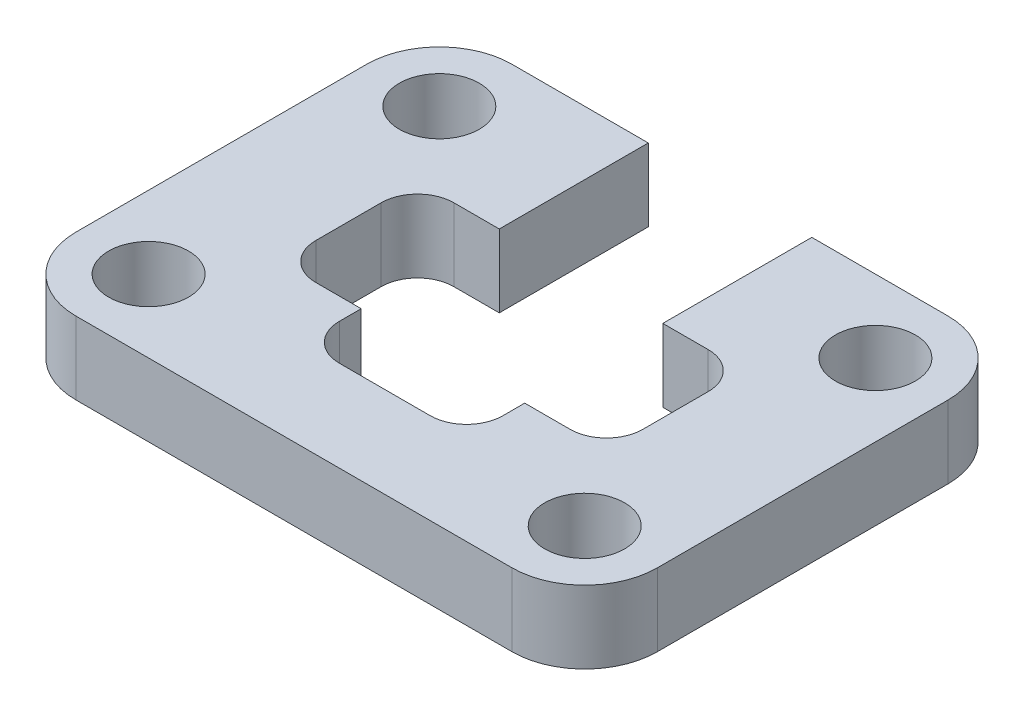
ISO-10303-21;
HEADER;
FILE_DESCRIPTION(('STEP AP214'),'2;1');
FILE_NAME('part.step','',(''),(''),'','','');
FILE_SCHEMA(('AUTOMOTIVE_DESIGN { 1 0 10303 214 1 1 1 1 }'));
ENDSEC;
DATA;
#1=APPLICATION_CONTEXT('core data for automotive mechanical design processes');
#2=APPLICATION_PROTOCOL_DEFINITION('international standard','automotive_design',2000,#1);
#3=PRODUCT_CONTEXT('',#1,'mechanical');
#4=PRODUCT('Part','Part','',(#3));
#5=PRODUCT_RELATED_PRODUCT_CATEGORY('part','',(#4));
#6=PRODUCT_DEFINITION_FORMATION('','',#4);
#7=PRODUCT_DEFINITION_CONTEXT('part definition',#1,'design');
#8=PRODUCT_DEFINITION('design','',#6,#7);
#9=PRODUCT_DEFINITION_SHAPE('','',#8);
#10=(LENGTH_UNIT() NAMED_UNIT(*) SI_UNIT(.MILLI.,.METRE.));
#11=(NAMED_UNIT(*) PLANE_ANGLE_UNIT() SI_UNIT($,.RADIAN.));
#12=(NAMED_UNIT(*) SI_UNIT($,.STERADIAN.) SOLID_ANGLE_UNIT());
#13=UNCERTAINTY_MEASURE_WITH_UNIT(LENGTH_MEASURE(1.E-05),#10,'distance_accuracy_value','');
#14=(GEOMETRIC_REPRESENTATION_CONTEXT(3) GLOBAL_UNCERTAINTY_ASSIGNED_CONTEXT((#13)) GLOBAL_UNIT_ASSIGNED_CONTEXT((#10,
#11,#12)) REPRESENTATION_CONTEXT('',''));
#15=CARTESIAN_POINT('',(0.,0.,0.));
#16=DIRECTION('',(0.,0.,1.));
#17=DIRECTION('',(1.,0.,0.));
#18=AXIS2_PLACEMENT_3D('',#15,#16,#17);
#19=CARTESIAN_POINT('',(2.25,2.,0.));
#20=DIRECTION('',(-1.,0.,0.));
#21=DIRECTION('',(0.,0.,1.));
#22=AXIS2_PLACEMENT_3D('',#19,#20,#21);
#23=PLANE('',#22);
#24=DIRECTION('',(0.,0.,-1.));
#25=VECTOR('',#24,1.);
#26=CARTESIAN_POINT('',(2.25,0.,0.));
#27=LINE('',#26,#25);
#28=CARTESIAN_POINT('',(2.25,0.,2.5));
#29=VERTEX_POINT('',#28);
#30=CARTESIAN_POINT('',(2.25,0.,1.9));
#31=VERTEX_POINT('',#30);
#32=EDGE_CURVE('E276',#29,#31,#27,.T.);
#33=ORIENTED_EDGE('',*,*,#32,.F.);
#34=DIRECTION('',(0.,-1.,0.));
#35=VECTOR('',#34,1.);
#36=CARTESIAN_POINT('',(2.25,2.,2.5));
#37=LINE('',#36,#35);
#38=CARTESIAN_POINT('',(2.25,2.,2.5));
#39=VERTEX_POINT('',#38);
#40=EDGE_CURVE('E353',#29,#39,#37,.F.);
#41=ORIENTED_EDGE('',*,*,#40,.T.);
#42=DIRECTION('',(0.,0.,-1.));
#43=VECTOR('',#42,1.);
#44=CARTESIAN_POINT('',(2.25,2.,0.));
#45=LINE('',#44,#43);
#46=CARTESIAN_POINT('',(2.25,2.,1.9));
#47=VERTEX_POINT('',#46);
#48=EDGE_CURVE('E236',#39,#47,#45,.T.);
#49=ORIENTED_EDGE('',*,*,#48,.T.);
#50=DIRECTION('',(0.,1.,0.));
#51=VECTOR('',#50,1.);
#52=CARTESIAN_POINT('',(2.25,2.,1.9));
#53=LINE('',#52,#51);
#54=EDGE_CURVE('E273',#31,#47,#53,.T.);
#55=ORIENTED_EDGE('',*,*,#54,.F.);
#56=EDGE_LOOP('',(#33,#41,#49,#55));
#57=FACE_BOUND('',#56,.T.);
#58=ADVANCED_FACE('F36',(#57),#23,.T.);
#59=CARTESIAN_POINT('',(-2.25,2.,0.));
#60=DIRECTION('',(-1.,0.,0.));
#61=DIRECTION('',(0.,0.,1.));
#62=AXIS2_PLACEMENT_3D('',#59,#60,#61);
#63=PLANE('',#62);
#64=DIRECTION('',(0.,0.,-1.));
#65=VECTOR('',#64,1.);
#66=CARTESIAN_POINT('',(-2.25,2.,0.));
#67=LINE('',#66,#65);
#68=CARTESIAN_POINT('',(-2.25,2.,2.5));
#69=VERTEX_POINT('',#68);
#70=CARTESIAN_POINT('',(-2.25,2.,1.9));
#71=VERTEX_POINT('',#70);
#72=EDGE_CURVE('E248',#69,#71,#67,.T.);
#73=ORIENTED_EDGE('',*,*,#72,.F.);
#74=DIRECTION('',(0.,-1.,0.));
#75=VECTOR('',#74,1.);
#76=CARTESIAN_POINT('',(-2.25,2.,2.5));
#77=LINE('',#76,#75);
#78=CARTESIAN_POINT('',(-2.25,0.,2.5));
#79=VERTEX_POINT('',#78);
#80=EDGE_CURVE('E355',#69,#79,#77,.T.);
#81=ORIENTED_EDGE('',*,*,#80,.T.);
#82=DIRECTION('',(0.,0.,-1.));
#83=VECTOR('',#82,1.);
#84=CARTESIAN_POINT('',(-2.25,0.,0.));
#85=LINE('',#84,#83);
#86=CARTESIAN_POINT('',(-2.25,0.,1.9));
#87=VERTEX_POINT('',#86);
#88=EDGE_CURVE('E282',#79,#87,#85,.T.);
#89=ORIENTED_EDGE('',*,*,#88,.T.);
#90=DIRECTION('',(0.,1.,0.));
#91=VECTOR('',#90,1.);
#92=CARTESIAN_POINT('',(-2.25,2.,1.9));
#93=LINE('',#92,#91);
#94=EDGE_CURVE('E227',#87,#71,#93,.T.);
#95=ORIENTED_EDGE('',*,*,#94,.T.);
#96=EDGE_LOOP('',(#73,#81,#89,#95));
#97=FACE_BOUND('',#96,.T.);
#98=ADVANCED_FACE('F460',(#97),#63,.F.);
#99=DIRECTION('',(0.,-1.,0.));
#100=VECTOR('',#99,1.);
#101=CARTESIAN_POINT('',(2.25,2.,-1.9));
#102=LINE('',#101,#100);
#103=CARTESIAN_POINT('',(2.25,2.,-1.9));
#104=VERTEX_POINT('',#103);
#105=CARTESIAN_POINT('',(2.25,0.,-1.9));
#106=VERTEX_POINT('',#105);
#107=EDGE_CURVE('E213',#104,#106,#102,.T.);
#108=ORIENTED_EDGE('',*,*,#107,.F.);
#109=CARTESIAN_POINT('',(2.25,2.,-6.));
#110=VERTEX_POINT('',#109);
#111=EDGE_CURVE('E224',#104,#110,#45,.T.);
#112=ORIENTED_EDGE('',*,*,#111,.T.);
#113=DIRECTION('',(0.,-1.,0.));
#114=VECTOR('',#113,1.);
#115=CARTESIAN_POINT('',(2.25,2.,-6.));
#116=LINE('',#115,#114);
#117=CARTESIAN_POINT('',(2.25,0.,-6.));
#118=VERTEX_POINT('',#117);
#119=EDGE_CURVE('E268',#110,#118,#116,.T.);
#120=ORIENTED_EDGE('',*,*,#119,.T.);
#121=EDGE_CURVE('E226',#106,#118,#27,.T.);
#122=ORIENTED_EDGE('',*,*,#121,.F.);
#123=EDGE_LOOP('',(#108,#112,#120,#122));
#124=FACE_BOUND('',#123,.T.);
#125=ADVANCED_FACE('F222',(#124),#23,.T.);
#126=CARTESIAN_POINT('',(0.,2.,3.5));
#127=DIRECTION('',(0.,0.,-1.));
#128=DIRECTION('',(-1.,0.,0.));
#129=AXIS2_PLACEMENT_3D('',#126,#127,#128);
#130=PLANE('',#129);
#131=DIRECTION('',(1.,0.,0.));
#132=VECTOR('',#131,1.);
#133=CARTESIAN_POINT('',(0.,2.,3.5));
#134=LINE('',#133,#132);
#135=CARTESIAN_POINT('',(-1.25,2.,3.5));
#136=VERTEX_POINT('',#135);
#137=CARTESIAN_POINT('',(1.25,2.,3.5));
#138=VERTEX_POINT('',#137);
#139=EDGE_CURVE('E239',#136,#138,#134,.T.);
#140=ORIENTED_EDGE('',*,*,#139,.T.);
#141=DIRECTION('',(0.,-1.,0.));
#142=VECTOR('',#141,1.);
#143=CARTESIAN_POINT('',(1.25,0.,3.5));
#144=LINE('',#143,#142);
#145=CARTESIAN_POINT('',(1.25,0.,3.5));
#146=VERTEX_POINT('',#145);
#147=EDGE_CURVE('E350',#138,#146,#144,.T.);
#148=ORIENTED_EDGE('',*,*,#147,.T.);
#149=DIRECTION('',(1.,0.,0.));
#150=VECTOR('',#149,1.);
#151=CARTESIAN_POINT('',(0.,0.,3.5));
#152=LINE('',#151,#150);
#153=CARTESIAN_POINT('',(-1.25,0.,3.5));
#154=VERTEX_POINT('',#153);
#155=EDGE_CURVE('E278',#154,#146,#152,.T.);
#156=ORIENTED_EDGE('',*,*,#155,.F.);
#157=DIRECTION('',(0.,-1.,0.));
#158=VECTOR('',#157,1.);
#159=CARTESIAN_POINT('',(-1.25,2.,3.5));
#160=LINE('',#159,#158);
#161=EDGE_CURVE('E348',#154,#136,#160,.F.);
#162=ORIENTED_EDGE('',*,*,#161,.T.);
#163=EDGE_LOOP('',(#140,#148,#156,#162));
#164=FACE_BOUND('',#163,.T.);
#165=ADVANCED_FACE('F471',(#164),#130,.T.);
#166=CARTESIAN_POINT('',(-2.25,2.,-1.9));
#167=VERTEX_POINT('',#166);
#168=CARTESIAN_POINT('',(-2.25,2.,-6.));
#169=VERTEX_POINT('',#168);
#170=EDGE_CURVE('E247',#167,#169,#67,.T.);
#171=ORIENTED_EDGE('',*,*,#170,.F.);
#172=DIRECTION('',(0.,-1.,0.));
#173=VECTOR('',#172,1.);
#174=CARTESIAN_POINT('',(-2.25,2.,-1.9));
#175=LINE('',#174,#173);
#176=CARTESIAN_POINT('',(-2.25,0.,-1.9));
#177=VERTEX_POINT('',#176);
#178=EDGE_CURVE('E228',#167,#177,#175,.T.);
#179=ORIENTED_EDGE('',*,*,#178,.T.);
#180=CARTESIAN_POINT('',(-2.25,0.,-6.));
#181=VERTEX_POINT('',#180);
#182=EDGE_CURVE('E281',#177,#181,#85,.T.);
#183=ORIENTED_EDGE('',*,*,#182,.T.);
#184=DIRECTION('',(0.,-1.,0.));
#185=VECTOR('',#184,1.);
#186=CARTESIAN_POINT('',(-2.25,2.,-6.));
#187=LINE('',#186,#185);
#188=EDGE_CURVE('E304',#169,#181,#187,.T.);
#189=ORIENTED_EDGE('',*,*,#188,.F.);
#190=EDGE_LOOP('',(#171,#179,#183,#189));
#191=FACE_BOUND('',#190,.T.);
#192=ADVANCED_FACE('F467',(#191),#63,.F.);
#193=CARTESIAN_POINT('',(0.,2.,-6.));
#194=DIRECTION('',(0.,0.,-1.));
#195=DIRECTION('',(-1.,0.,0.));
#196=AXIS2_PLACEMENT_3D('',#193,#194,#195);
#197=PLANE('',#196);
#198=DIRECTION('',(1.,0.,0.));
#199=VECTOR('',#198,1.);
#200=CARTESIAN_POINT('',(0.,0.,-6.));
#201=LINE('',#200,#199);
#202=CARTESIAN_POINT('',(-6.,0.,-6.));
#203=VERTEX_POINT('',#202);
#204=EDGE_CURVE('E285',#203,#181,#201,.T.);
#205=ORIENTED_EDGE('',*,*,#204,.F.);
#206=DIRECTION('',(0.,-1.,0.));
#207=VECTOR('',#206,1.);
#208=CARTESIAN_POINT('',(-6.,2.,-6.));
#209=LINE('',#208,#207);
#210=CARTESIAN_POINT('',(-6.,2.,-6.));
#211=VERTEX_POINT('',#210);
#212=EDGE_CURVE('E346',#203,#211,#209,.F.);
#213=ORIENTED_EDGE('',*,*,#212,.T.);
#214=DIRECTION('',(1.,0.,0.));
#215=VECTOR('',#214,1.);
#216=CARTESIAN_POINT('',(0.,2.,-6.));
#217=LINE('',#216,#215);
#218=EDGE_CURVE('E251',#211,#169,#217,.T.);
#219=ORIENTED_EDGE('',*,*,#218,.T.);
#220=ORIENTED_EDGE('',*,*,#188,.T.);
#221=EDGE_LOOP('',(#205,#213,#219,#220));
#222=FACE_BOUND('',#221,.T.);
#223=ADVANCED_FACE('F457',(#222),#197,.T.);
#224=CARTESIAN_POINT('',(-8.,2.,0.));
#225=DIRECTION('',(-1.,0.,0.));
#226=DIRECTION('',(0.,0.,1.));
#227=AXIS2_PLACEMENT_3D('',#224,#225,#226);
#228=PLANE('',#227);
#229=DIRECTION('',(0.,0.,-1.));
#230=VECTOR('',#229,1.);
#231=CARTESIAN_POINT('',(-8.,0.,0.));
#232=LINE('',#231,#230);
#233=CARTESIAN_POINT('',(-8.,0.,4.));
#234=VERTEX_POINT('',#233);
#235=CARTESIAN_POINT('',(-8.,0.,-4.));
#236=VERTEX_POINT('',#235);
#237=EDGE_CURVE('E287',#234,#236,#232,.T.);
#238=ORIENTED_EDGE('',*,*,#237,.F.);
#239=DIRECTION('',(0.,-1.,0.));
#240=VECTOR('',#239,1.);
#241=CARTESIAN_POINT('',(-8.,2.,4.));
#242=LINE('',#241,#240);
#243=CARTESIAN_POINT('',(-8.,2.,4.));
#244=VERTEX_POINT('',#243);
#245=EDGE_CURVE('E328',#234,#244,#242,.F.);
#246=ORIENTED_EDGE('',*,*,#245,.T.);
#247=DIRECTION('',(0.,0.,-1.));
#248=VECTOR('',#247,1.);
#249=CARTESIAN_POINT('',(-8.,2.,0.));
#250=LINE('',#249,#248);
#251=CARTESIAN_POINT('',(-8.,2.,-4.));
#252=VERTEX_POINT('',#251);
#253=EDGE_CURVE('E253',#244,#252,#250,.T.);
#254=ORIENTED_EDGE('',*,*,#253,.T.);
#255=DIRECTION('',(0.,-1.,0.));
#256=VECTOR('',#255,1.);
#257=CARTESIAN_POINT('',(-8.,2.,-4.));
#258=LINE('',#257,#256);
#259=EDGE_CURVE('E325',#252,#236,#258,.T.);
#260=ORIENTED_EDGE('',*,*,#259,.T.);
#261=EDGE_LOOP('',(#238,#246,#254,#260));
#262=FACE_BOUND('',#261,.T.);
#263=ADVANCED_FACE('F481',(#262),#228,.T.);
#264=CARTESIAN_POINT('',(0.,2.,6.));
#265=DIRECTION('',(0.,0.,-1.));
#266=DIRECTION('',(-1.,0.,0.));
#267=AXIS2_PLACEMENT_3D('',#264,#265,#266);
#268=PLANE('',#267);
#269=DIRECTION('',(1.,0.,0.));
#270=VECTOR('',#269,1.);
#271=CARTESIAN_POINT('',(0.,2.,6.));
#272=LINE('',#271,#270);
#273=CARTESIAN_POINT('',(-6.,2.,6.));
#274=VERTEX_POINT('',#273);
#275=CARTESIAN_POINT('',(6.,2.,6.));
#276=VERTEX_POINT('',#275);
#277=EDGE_CURVE('E256',#274,#276,#272,.T.);
#278=ORIENTED_EDGE('',*,*,#277,.F.);
#279=DIRECTION('',(0.,-1.,0.));
#280=VECTOR('',#279,1.);
#281=CARTESIAN_POINT('',(-6.,0.,6.));
#282=LINE('',#281,#280);
#283=CARTESIAN_POINT('',(-6.,0.,6.));
#284=VERTEX_POINT('',#283);
#285=EDGE_CURVE('E314',#274,#284,#282,.T.);
#286=ORIENTED_EDGE('',*,*,#285,.T.);
#287=DIRECTION('',(1.,0.,0.));
#288=VECTOR('',#287,1.);
#289=CARTESIAN_POINT('',(0.,0.,6.));
#290=LINE('',#289,#288);
#291=CARTESIAN_POINT('',(6.,0.,6.));
#292=VERTEX_POINT('',#291);
#293=EDGE_CURVE('E291',#284,#292,#290,.T.);
#294=ORIENTED_EDGE('',*,*,#293,.T.);
#295=DIRECTION('',(0.,-1.,0.));
#296=VECTOR('',#295,1.);
#297=CARTESIAN_POINT('',(6.,2.,6.));
#298=LINE('',#297,#296);
#299=EDGE_CURVE('E312',#292,#276,#298,.F.);
#300=ORIENTED_EDGE('',*,*,#299,.T.);
#301=EDGE_LOOP('',(#278,#286,#294,#300));
#302=FACE_BOUND('',#301,.T.);
#303=ADVANCED_FACE('F484',(#302),#268,.F.);
#304=CARTESIAN_POINT('',(8.,2.,0.));
#305=DIRECTION('',(-1.,0.,0.));
#306=DIRECTION('',(0.,0.,1.));
#307=AXIS2_PLACEMENT_3D('',#304,#305,#306);
#308=PLANE('',#307);
#309=DIRECTION('',(0.,0.,-1.));
#310=VECTOR('',#309,1.);
#311=CARTESIAN_POINT('',(8.,2.,0.));
#312=LINE('',#311,#310);
#313=CARTESIAN_POINT('',(8.,2.,4.));
#314=VERTEX_POINT('',#313);
#315=CARTESIAN_POINT('',(8.,2.,-4.));
#316=VERTEX_POINT('',#315);
#317=EDGE_CURVE('E259',#314,#316,#312,.T.);
#318=ORIENTED_EDGE('',*,*,#317,.F.);
#319=DIRECTION('',(0.,-1.,0.));
#320=VECTOR('',#319,1.);
#321=CARTESIAN_POINT('',(8.,2.,4.));
#322=LINE('',#321,#320);
#323=CARTESIAN_POINT('',(8.,0.,4.));
#324=VERTEX_POINT('',#323);
#325=EDGE_CURVE('E340',#314,#324,#322,.T.);
#326=ORIENTED_EDGE('',*,*,#325,.T.);
#327=DIRECTION('',(0.,0.,-1.));
#328=VECTOR('',#327,1.);
#329=CARTESIAN_POINT('',(8.,0.,0.));
#330=LINE('',#329,#328);
#331=CARTESIAN_POINT('',(8.,0.,-4.));
#332=VERTEX_POINT('',#331);
#333=EDGE_CURVE('E294',#324,#332,#330,.T.);
#334=ORIENTED_EDGE('',*,*,#333,.T.);
#335=DIRECTION('',(0.,-1.,0.));
#336=VECTOR('',#335,1.);
#337=CARTESIAN_POINT('',(8.,2.,-4.));
#338=LINE('',#337,#336);
#339=EDGE_CURVE('E338',#332,#316,#338,.F.);
#340=ORIENTED_EDGE('',*,*,#339,.T.);
#341=EDGE_LOOP('',(#318,#326,#334,#340));
#342=FACE_BOUND('',#341,.T.);
#343=ADVANCED_FACE('F488',(#342),#308,.F.);
#344=CARTESIAN_POINT('',(6.,2.,4.));
#345=DIRECTION('',(0.,-1.,0.));
#346=DIRECTION('',(0.,0.,-1.));
#347=AXIS2_PLACEMENT_3D('',#344,#345,#346);
#348=CYLINDRICAL_SURFACE('',#347,1.1);
#349=CARTESIAN_POINT('',(6.,2.,4.));
#350=DIRECTION('',(0.,1.,0.));
#351=DIRECTION('',(0.,0.,1.));
#352=AXIS2_PLACEMENT_3D('',#349,#350,#351);
#353=CIRCLE('',#352,1.1);
#354=CARTESIAN_POINT('',(6.,2.,5.1));
#355=VERTEX_POINT('',#354);
#356=EDGE_CURVE('E262',#355,#355,#353,.T.);
#357=ORIENTED_EDGE('',*,*,#356,.T.);
#358=EDGE_LOOP('',(#357));
#359=FACE_BOUND('',#358,.T.);
#360=CARTESIAN_POINT('',(6.,0.,4.));
#361=DIRECTION('',(0.,1.,0.));
#362=DIRECTION('',(0.,0.,1.));
#363=AXIS2_PLACEMENT_3D('',#360,#361,#362);
#364=CIRCLE('',#363,1.1);
#365=CARTESIAN_POINT('',(6.,0.,5.1));
#366=VERTEX_POINT('',#365);
#367=EDGE_CURVE('E297',#366,#366,#364,.T.);
#368=ORIENTED_EDGE('',*,*,#367,.F.);
#369=EDGE_LOOP('',(#368));
#370=FACE_BOUND('',#369,.T.);
#371=ADVANCED_FACE('F454',(#359,#370),#348,.F.);
#372=CARTESIAN_POINT('',(6.,2.,-6.));
#373=VERTEX_POINT('',#372);
#374=EDGE_CURVE('E235',#110,#373,#217,.T.);
#375=ORIENTED_EDGE('',*,*,#374,.T.);
#376=DIRECTION('',(0.,-1.,0.));
#377=VECTOR('',#376,1.);
#378=CARTESIAN_POINT('',(6.,0.,-6.));
#379=LINE('',#378,#377);
#380=CARTESIAN_POINT('',(6.,0.,-6.));
#381=VERTEX_POINT('',#380);
#382=EDGE_CURVE('E343',#373,#381,#379,.T.);
#383=ORIENTED_EDGE('',*,*,#382,.T.);
#384=EDGE_CURVE('E288',#118,#381,#201,.T.);
#385=ORIENTED_EDGE('',*,*,#384,.F.);
#386=ORIENTED_EDGE('',*,*,#119,.F.);
#387=EDGE_LOOP('',(#375,#383,#385,#386));
#388=FACE_BOUND('',#387,.T.);
#389=ADVANCED_FACE('F448',(#388),#197,.T.);
#390=CARTESIAN_POINT('',(-6.,2.,-4.));
#391=DIRECTION('',(0.,-1.,0.));
#392=DIRECTION('',(0.,0.,-1.));
#393=AXIS2_PLACEMENT_3D('',#390,#391,#392);
#394=CYLINDRICAL_SURFACE('',#393,1.1);
#395=CARTESIAN_POINT('',(-6.,2.,-4.));
#396=DIRECTION('',(0.,1.,0.));
#397=DIRECTION('',(0.,0.,1.));
#398=AXIS2_PLACEMENT_3D('',#395,#396,#397);
#399=CIRCLE('',#398,1.1);
#400=CARTESIAN_POINT('',(-6.,2.,-2.9));
#401=VERTEX_POINT('',#400);
#402=EDGE_CURVE('E237',#401,#401,#399,.T.);
#403=ORIENTED_EDGE('',*,*,#402,.T.);
#404=EDGE_LOOP('',(#403));
#405=FACE_BOUND('',#404,.T.);
#406=CARTESIAN_POINT('',(-6.,0.,-4.));
#407=DIRECTION('',(0.,1.,0.));
#408=DIRECTION('',(0.,0.,1.));
#409=AXIS2_PLACEMENT_3D('',#406,#407,#408);
#410=CIRCLE('',#409,1.1);
#411=CARTESIAN_POINT('',(-6.,0.,-2.9));
#412=VERTEX_POINT('',#411);
#413=EDGE_CURVE('E272',#412,#412,#410,.T.);
#414=ORIENTED_EDGE('',*,*,#413,.F.);
#415=EDGE_LOOP('',(#414));
#416=FACE_BOUND('',#415,.T.);
#417=ADVANCED_FACE('F437',(#405,#416),#394,.F.);
#418=CARTESIAN_POINT('',(-6.,2.,4.));
#419=DIRECTION('',(0.,-1.,0.));
#420=DIRECTION('',(0.,0.,-1.));
#421=AXIS2_PLACEMENT_3D('',#418,#419,#420);
#422=CYLINDRICAL_SURFACE('',#421,1.1);
#423=CARTESIAN_POINT('',(-6.,2.,4.));
#424=DIRECTION('',(0.,1.,0.));
#425=DIRECTION('',(0.,0.,1.));
#426=AXIS2_PLACEMENT_3D('',#423,#424,#425);
#427=CIRCLE('',#426,1.1);
#428=CARTESIAN_POINT('',(-6.,2.,5.1));
#429=VERTEX_POINT('',#428);
#430=EDGE_CURVE('E241',#429,#429,#427,.F.);
#431=ORIENTED_EDGE('',*,*,#430,.F.);
#432=EDGE_LOOP('',(#431));
#433=FACE_BOUND('',#432,.T.);
#434=CARTESIAN_POINT('',(-6.,0.,4.));
#435=DIRECTION('',(0.,1.,0.));
#436=DIRECTION('',(0.,0.,1.));
#437=AXIS2_PLACEMENT_3D('',#434,#435,#436);
#438=CIRCLE('',#437,1.1);
#439=CARTESIAN_POINT('',(-6.,0.,5.1));
#440=VERTEX_POINT('',#439);
#441=EDGE_CURVE('E269',#440,#440,#438,.F.);
#442=ORIENTED_EDGE('',*,*,#441,.T.);
#443=EDGE_LOOP('',(#442));
#444=FACE_BOUND('',#443,.T.);
#445=ADVANCED_FACE('F433',(#433,#444),#422,.F.);
#446=CARTESIAN_POINT('',(6.,2.,-4.));
#447=DIRECTION('',(0.,-1.,0.));
#448=DIRECTION('',(0.,0.,-1.));
#449=AXIS2_PLACEMENT_3D('',#446,#447,#448);
#450=CYLINDRICAL_SURFACE('',#449,1.1);
#451=CARTESIAN_POINT('',(6.,2.,-4.));
#452=DIRECTION('',(0.,1.,0.));
#453=DIRECTION('',(0.,0.,1.));
#454=AXIS2_PLACEMENT_3D('',#451,#452,#453);
#455=CIRCLE('',#454,1.1);
#456=CARTESIAN_POINT('',(6.,2.,-2.9));
#457=VERTEX_POINT('',#456);
#458=EDGE_CURVE('E265',#457,#457,#455,.F.);
#459=ORIENTED_EDGE('',*,*,#458,.F.);
#460=EDGE_LOOP('',(#459));
#461=FACE_BOUND('',#460,.T.);
#462=CARTESIAN_POINT('',(6.,0.,-4.));
#463=DIRECTION('',(0.,1.,0.));
#464=DIRECTION('',(0.,0.,1.));
#465=AXIS2_PLACEMENT_3D('',#462,#463,#464);
#466=CIRCLE('',#465,1.1);
#467=CARTESIAN_POINT('',(6.,0.,-2.9));
#468=VERTEX_POINT('',#467);
#469=EDGE_CURVE('E300',#468,#468,#466,.F.);
#470=ORIENTED_EDGE('',*,*,#469,.T.);
#471=EDGE_LOOP('',(#470));
#472=FACE_BOUND('',#471,.T.);
#473=ADVANCED_FACE('F436',(#461,#472),#450,.F.);
#474=CARTESIAN_POINT('',(0.,2.,0.));
#475=DIRECTION('',(0.,1.,0.));
#476=DIRECTION('',(0.,0.,1.));
#477=AXIS2_PLACEMENT_3D('',#474,#475,#476);
#478=PLANE('',#477);
#479=ORIENTED_EDGE('',*,*,#253,.F.);
#480=CARTESIAN_POINT('',(-6.,2.,4.));
#481=DIRECTION('',(0.,1.,0.));
#482=DIRECTION('',(0.,0.,1.));
#483=AXIS2_PLACEMENT_3D('',#480,#481,#482);
#484=CIRCLE('',#483,2.);
#485=EDGE_CURVE('E336',#244,#274,#484,.T.);
#486=ORIENTED_EDGE('',*,*,#485,.T.);
#487=ORIENTED_EDGE('',*,*,#277,.T.);
#488=CARTESIAN_POINT('',(6.,2.,4.));
#489=DIRECTION('',(0.,1.,0.));
#490=DIRECTION('',(0.,0.,1.));
#491=AXIS2_PLACEMENT_3D('',#488,#489,#490);
#492=CIRCLE('',#491,2.);
#493=EDGE_CURVE('E334',#276,#314,#492,.T.);
#494=ORIENTED_EDGE('',*,*,#493,.T.);
#495=ORIENTED_EDGE('',*,*,#317,.T.);
#496=CARTESIAN_POINT('',(6.,2.,-4.));
#497=DIRECTION('',(0.,1.,0.));
#498=DIRECTION('',(0.,0.,1.));
#499=AXIS2_PLACEMENT_3D('',#496,#497,#498);
#500=CIRCLE('',#499,2.);
#501=EDGE_CURVE('E332',#316,#373,#500,.T.);
#502=ORIENTED_EDGE('',*,*,#501,.T.);
#503=ORIENTED_EDGE('',*,*,#374,.F.);
#504=ORIENTED_EDGE('',*,*,#111,.F.);
#505=DIRECTION('',(-1.,0.,0.));
#506=VECTOR('',#505,1.);
#507=CARTESIAN_POINT('',(-4.5,2.,-1.9));
#508=LINE('',#507,#506);
#509=CARTESIAN_POINT('',(3.5,2.,-1.9));
#510=VERTEX_POINT('',#509);
#511=EDGE_CURVE('E209',#510,#104,#508,.T.);
#512=ORIENTED_EDGE('',*,*,#511,.F.);
#513=CARTESIAN_POINT('',(3.5,2.,-0.9));
#514=DIRECTION('',(0.,1.,0.));
#515=DIRECTION('',(0.,0.,1.));
#516=AXIS2_PLACEMENT_3D('',#513,#514,#515);
#517=CIRCLE('',#516,1.);
#518=CARTESIAN_POINT('',(4.5,2.,-0.9));
#519=VERTEX_POINT('',#518);
#520=EDGE_CURVE('E391',#510,#519,#517,.F.);
#521=ORIENTED_EDGE('',*,*,#520,.T.);
#522=DIRECTION('',(0.,0.,-1.));
#523=VECTOR('',#522,1.);
#524=CARTESIAN_POINT('',(4.5,2.,-1.9));
#525=LINE('',#524,#523);
#526=CARTESIAN_POINT('',(4.5,2.,0.899999999999999));
#527=VERTEX_POINT('',#526);
#528=EDGE_CURVE('E410',#527,#519,#525,.T.);
#529=ORIENTED_EDGE('',*,*,#528,.F.);
#530=CARTESIAN_POINT('',(3.5,2.,0.9));
#531=DIRECTION('',(0.,1.,0.));
#532=DIRECTION('',(0.,0.,1.));
#533=AXIS2_PLACEMENT_3D('',#530,#531,#532);
#534=CIRCLE('',#533,1.);
#535=CARTESIAN_POINT('',(3.5,2.,1.9));
#536=VERTEX_POINT('',#535);
#537=EDGE_CURVE('E387',#527,#536,#534,.F.);
#538=ORIENTED_EDGE('',*,*,#537,.T.);
#539=DIRECTION('',(1.,0.,0.));
#540=VECTOR('',#539,1.);
#541=CARTESIAN_POINT('',(-4.5,2.,1.9));
#542=LINE('',#541,#540);
#543=EDGE_CURVE('E421',#47,#536,#542,.T.);
#544=ORIENTED_EDGE('',*,*,#543,.F.);
#545=ORIENTED_EDGE('',*,*,#48,.F.);
#546=CARTESIAN_POINT('',(1.25,2.,2.5));
#547=DIRECTION('',(0.,1.,0.));
#548=DIRECTION('',(0.,0.,1.));
#549=AXIS2_PLACEMENT_3D('',#546,#547,#548);
#550=CIRCLE('',#549,1.);
#551=EDGE_CURVE('E377',#39,#138,#550,.F.);
#552=ORIENTED_EDGE('',*,*,#551,.T.);
#553=ORIENTED_EDGE('',*,*,#139,.F.);
#554=CARTESIAN_POINT('',(-1.25,2.,2.5));
#555=DIRECTION('',(0.,1.,0.));
#556=DIRECTION('',(0.,0.,1.));
#557=AXIS2_PLACEMENT_3D('',#554,#555,#556);
#558=CIRCLE('',#557,1.);
#559=EDGE_CURVE('E381',#136,#69,#558,.F.);
#560=ORIENTED_EDGE('',*,*,#559,.T.);
#561=ORIENTED_EDGE('',*,*,#72,.T.);
#562=CARTESIAN_POINT('',(-3.5,2.,1.9));
#563=VERTEX_POINT('',#562);
#564=EDGE_CURVE('E422',#563,#71,#542,.T.);
#565=ORIENTED_EDGE('',*,*,#564,.F.);
#566=CARTESIAN_POINT('',(-3.5,2.,0.9));
#567=DIRECTION('',(0.,1.,0.));
#568=DIRECTION('',(0.,0.,1.));
#569=AXIS2_PLACEMENT_3D('',#566,#567,#568);
#570=CIRCLE('',#569,1.);
#571=CARTESIAN_POINT('',(-4.5,2.,0.899999999999999));
#572=VERTEX_POINT('',#571);
#573=EDGE_CURVE('E383',#563,#572,#570,.F.);
#574=ORIENTED_EDGE('',*,*,#573,.T.);
#575=DIRECTION('',(0.,0.,1.));
#576=VECTOR('',#575,1.);
#577=CARTESIAN_POINT('',(-4.5,2.,-1.9));
#578=LINE('',#577,#576);
#579=CARTESIAN_POINT('',(-4.5,2.,-0.9));
#580=VERTEX_POINT('',#579);
#581=EDGE_CURVE('E218',#580,#572,#578,.T.);
#582=ORIENTED_EDGE('',*,*,#581,.F.);
#583=CARTESIAN_POINT('',(-3.5,2.,-0.9));
#584=DIRECTION('',(0.,1.,0.));
#585=DIRECTION('',(0.,0.,1.));
#586=AXIS2_PLACEMENT_3D('',#583,#584,#585);
#587=CIRCLE('',#586,1.);
#588=CARTESIAN_POINT('',(-3.5,2.,-1.9));
#589=VERTEX_POINT('',#588);
#590=EDGE_CURVE('E44',#580,#589,#587,.F.);
#591=ORIENTED_EDGE('',*,*,#590,.T.);
#592=EDGE_CURVE('E219',#167,#589,#508,.T.);
#593=ORIENTED_EDGE('',*,*,#592,.F.);
#594=ORIENTED_EDGE('',*,*,#170,.T.);
#595=ORIENTED_EDGE('',*,*,#218,.F.);
#596=CARTESIAN_POINT('',(-6.,2.,-4.));
#597=DIRECTION('',(0.,1.,0.));
#598=DIRECTION('',(0.,0.,1.));
#599=AXIS2_PLACEMENT_3D('',#596,#597,#598);
#600=CIRCLE('',#599,2.);
#601=EDGE_CURVE('E330',#211,#252,#600,.T.);
#602=ORIENTED_EDGE('',*,*,#601,.T.);
#603=EDGE_LOOP('',(#479,#486,#487,#494,#495,#502,#503,#504,#512,#521,#529,#538,#544,#545,#552,
#553,#560,#561,#565,#574,#582,#591,#593,#594,#595,#602));
#604=FACE_BOUND('',#603,.T.);
#605=ORIENTED_EDGE('',*,*,#430,.T.);
#606=EDGE_LOOP('',(#605));
#607=FACE_BOUND('',#606,.T.);
#608=ORIENTED_EDGE('',*,*,#402,.F.);
#609=EDGE_LOOP('',(#608));
#610=FACE_BOUND('',#609,.T.);
#611=ORIENTED_EDGE('',*,*,#356,.F.);
#612=EDGE_LOOP('',(#611));
#613=FACE_BOUND('',#612,.T.);
#614=ORIENTED_EDGE('',*,*,#458,.T.);
#615=EDGE_LOOP('',(#614));
#616=FACE_BOUND('',#615,.T.);
#617=ADVANCED_FACE('F232',(#604,#607,#610,#613,#616),#478,.T.);
#618=CARTESIAN_POINT('',(0.,0.,0.));
#619=DIRECTION('',(0.,1.,0.));
#620=DIRECTION('',(0.,0.,1.));
#621=AXIS2_PLACEMENT_3D('',#618,#619,#620);
#622=PLANE('',#621);
#623=ORIENTED_EDGE('',*,*,#441,.F.);
#624=EDGE_LOOP('',(#623));
#625=FACE_BOUND('',#624,.T.);
#626=ORIENTED_EDGE('',*,*,#413,.T.);
#627=EDGE_LOOP('',(#626));
#628=FACE_BOUND('',#627,.T.);
#629=ORIENTED_EDGE('',*,*,#293,.F.);
#630=CARTESIAN_POINT('',(-6.,0.,4.));
#631=DIRECTION('',(0.,1.,0.));
#632=DIRECTION('',(0.,0.,1.));
#633=AXIS2_PLACEMENT_3D('',#630,#631,#632);
#634=CIRCLE('',#633,2.);
#635=EDGE_CURVE('E323',#284,#234,#634,.F.);
#636=ORIENTED_EDGE('',*,*,#635,.T.);
#637=ORIENTED_EDGE('',*,*,#237,.T.);
#638=CARTESIAN_POINT('',(-6.,0.,-4.));
#639=DIRECTION('',(0.,1.,0.));
#640=DIRECTION('',(0.,0.,1.));
#641=AXIS2_PLACEMENT_3D('',#638,#639,#640);
#642=CIRCLE('',#641,2.);
#643=EDGE_CURVE('E317',#236,#203,#642,.F.);
#644=ORIENTED_EDGE('',*,*,#643,.T.);
#645=ORIENTED_EDGE('',*,*,#204,.T.);
#646=ORIENTED_EDGE('',*,*,#182,.F.);
#647=DIRECTION('',(-1.,0.,0.));
#648=VECTOR('',#647,1.);
#649=CARTESIAN_POINT('',(0.,0.,-1.9));
#650=LINE('',#649,#648);
#651=CARTESIAN_POINT('',(-3.5,0.,-1.9));
#652=VERTEX_POINT('',#651);
#653=EDGE_CURVE('E307',#177,#652,#650,.T.);
#654=ORIENTED_EDGE('',*,*,#653,.T.);
#655=CARTESIAN_POINT('',(-3.5,0.,-0.9));
#656=DIRECTION('',(0.,1.,0.));
#657=DIRECTION('',(0.,0.,1.));
#658=AXIS2_PLACEMENT_3D('',#655,#656,#657);
#659=CIRCLE('',#658,1.);
#660=CARTESIAN_POINT('',(-4.5,0.,-0.9));
#661=VERTEX_POINT('',#660);
#662=EDGE_CURVE('E11',#652,#661,#659,.T.);
#663=ORIENTED_EDGE('',*,*,#662,.T.);
#664=DIRECTION('',(0.,0.,1.));
#665=VECTOR('',#664,1.);
#666=CARTESIAN_POINT('',(-4.5,0.,-1.9));
#667=LINE('',#666,#665);
#668=CARTESIAN_POINT('',(-4.5,0.,0.899999999999999));
#669=VERTEX_POINT('',#668);
#670=EDGE_CURVE('E405',#661,#669,#667,.T.);
#671=ORIENTED_EDGE('',*,*,#670,.T.);
#672=CARTESIAN_POINT('',(-3.5,0.,0.9));
#673=DIRECTION('',(0.,1.,0.));
#674=DIRECTION('',(0.,0.,1.));
#675=AXIS2_PLACEMENT_3D('',#672,#673,#674);
#676=CIRCLE('',#675,1.);
#677=CARTESIAN_POINT('',(-3.5,0.,1.9));
#678=VERTEX_POINT('',#677);
#679=EDGE_CURVE('E385',#669,#678,#676,.T.);
#680=ORIENTED_EDGE('',*,*,#679,.T.);
#681=DIRECTION('',(1.,0.,0.));
#682=VECTOR('',#681,1.);
#683=CARTESIAN_POINT('',(-4.5,0.,1.9));
#684=LINE('',#683,#682);
#685=EDGE_CURVE('E416',#678,#87,#684,.T.);
#686=ORIENTED_EDGE('',*,*,#685,.T.);
#687=ORIENTED_EDGE('',*,*,#88,.F.);
#688=CARTESIAN_POINT('',(-1.25,0.,2.5));
#689=DIRECTION('',(0.,1.,0.));
#690=DIRECTION('',(0.,0.,1.));
#691=AXIS2_PLACEMENT_3D('',#688,#689,#690);
#692=CIRCLE('',#691,1.);
#693=EDGE_CURVE('E379',#79,#154,#692,.T.);
#694=ORIENTED_EDGE('',*,*,#693,.T.);
#695=ORIENTED_EDGE('',*,*,#155,.T.);
#696=CARTESIAN_POINT('',(1.25,0.,2.5));
#697=DIRECTION('',(0.,1.,0.));
#698=DIRECTION('',(0.,0.,1.));
#699=AXIS2_PLACEMENT_3D('',#696,#697,#698);
#700=CIRCLE('',#699,1.);
#701=EDGE_CURVE('E375',#146,#29,#700,.T.);
#702=ORIENTED_EDGE('',*,*,#701,.T.);
#703=ORIENTED_EDGE('',*,*,#32,.T.);
#704=DIRECTION('',(1.,0.,0.));
#705=VECTOR('',#704,1.);
#706=CARTESIAN_POINT('',(0.,0.,1.9));
#707=LINE('',#706,#705);
#708=CARTESIAN_POINT('',(3.5,0.,1.9));
#709=VERTEX_POINT('',#708);
#710=EDGE_CURVE('E309',#31,#709,#707,.T.);
#711=ORIENTED_EDGE('',*,*,#710,.T.);
#712=CARTESIAN_POINT('',(3.5,0.,0.9));
#713=DIRECTION('',(0.,1.,0.));
#714=DIRECTION('',(0.,0.,1.));
#715=AXIS2_PLACEMENT_3D('',#712,#713,#714);
#716=CIRCLE('',#715,1.);
#717=CARTESIAN_POINT('',(4.5,0.,0.899999999999999));
#718=VERTEX_POINT('',#717);
#719=EDGE_CURVE('E389',#709,#718,#716,.T.);
#720=ORIENTED_EDGE('',*,*,#719,.T.);
#721=DIRECTION('',(0.,0.,-1.));
#722=VECTOR('',#721,1.);
#723=CARTESIAN_POINT('',(4.5,0.,-1.9));
#724=LINE('',#723,#722);
#725=CARTESIAN_POINT('',(4.5,0.,-0.9));
#726=VERTEX_POINT('',#725);
#727=EDGE_CURVE('E402',#718,#726,#724,.T.);
#728=ORIENTED_EDGE('',*,*,#727,.T.);
#729=CARTESIAN_POINT('',(3.5,0.,-0.9));
#730=DIRECTION('',(0.,1.,0.));
#731=DIRECTION('',(0.,0.,1.));
#732=AXIS2_PLACEMENT_3D('',#729,#730,#731);
#733=CIRCLE('',#732,1.);
#734=CARTESIAN_POINT('',(3.5,0.,-1.9));
#735=VERTEX_POINT('',#734);
#736=EDGE_CURVE('E393',#726,#735,#733,.T.);
#737=ORIENTED_EDGE('',*,*,#736,.T.);
#738=DIRECTION('',(-1.,0.,0.));
#739=VECTOR('',#738,1.);
#740=CARTESIAN_POINT('',(-4.5,0.,-1.9));
#741=LINE('',#740,#739);
#742=EDGE_CURVE('E400',#735,#106,#741,.T.);
#743=ORIENTED_EDGE('',*,*,#742,.T.);
#744=ORIENTED_EDGE('',*,*,#121,.T.);
#745=ORIENTED_EDGE('',*,*,#384,.T.);
#746=CARTESIAN_POINT('',(6.,0.,-4.));
#747=DIRECTION('',(0.,1.,0.));
#748=DIRECTION('',(0.,0.,1.));
#749=AXIS2_PLACEMENT_3D('',#746,#747,#748);
#750=CIRCLE('',#749,2.);
#751=EDGE_CURVE('E319',#381,#332,#750,.F.);
#752=ORIENTED_EDGE('',*,*,#751,.T.);
#753=ORIENTED_EDGE('',*,*,#333,.F.);
#754=CARTESIAN_POINT('',(6.,0.,4.));
#755=DIRECTION('',(0.,1.,0.));
#756=DIRECTION('',(0.,0.,1.));
#757=AXIS2_PLACEMENT_3D('',#754,#755,#756);
#758=CIRCLE('',#757,2.);
#759=EDGE_CURVE('E321',#324,#292,#758,.F.);
#760=ORIENTED_EDGE('',*,*,#759,.T.);
#761=EDGE_LOOP('',(#629,#636,#637,#644,#645,#646,#654,#663,#671,#680,#686,#687,#694,#695,#702,
#703,#711,#720,#728,#737,#743,#744,#745,#752,#753,#760));
#762=FACE_BOUND('',#761,.T.);
#763=ORIENTED_EDGE('',*,*,#367,.T.);
#764=EDGE_LOOP('',(#763));
#765=FACE_BOUND('',#764,.T.);
#766=ORIENTED_EDGE('',*,*,#469,.F.);
#767=EDGE_LOOP('',(#766));
#768=FACE_BOUND('',#767,.T.);
#769=ADVANCED_FACE('F398',(#625,#628,#762,#765,#768),#622,.F.);
#770=CARTESIAN_POINT('',(-4.5,0.,-1.9));
#771=DIRECTION('',(0.,0.,-1.));
#772=DIRECTION('',(-1.,0.,0.));
#773=AXIS2_PLACEMENT_3D('',#770,#771,#772);
#774=PLANE('',#773);
#775=ORIENTED_EDGE('',*,*,#592,.T.);
#776=DIRECTION('',(0.,1.,0.));
#777=VECTOR('',#776,1.);
#778=CARTESIAN_POINT('',(-3.5,0.,-1.9));
#779=LINE('',#778,#777);
#780=EDGE_CURVE('E51',#589,#652,#779,.F.);
#781=ORIENTED_EDGE('',*,*,#780,.T.);
#782=ORIENTED_EDGE('',*,*,#653,.F.);
#783=ORIENTED_EDGE('',*,*,#178,.F.);
#784=EDGE_LOOP('',(#775,#781,#782,#783));
#785=FACE_BOUND('',#784,.T.);
#786=ADVANCED_FACE('F443',(#785),#774,.F.);
#787=CARTESIAN_POINT('',(-4.5,0.,-1.9));
#788=DIRECTION('',(-1.,0.,0.));
#789=DIRECTION('',(0.,0.,1.));
#790=AXIS2_PLACEMENT_3D('',#787,#788,#789);
#791=PLANE('',#790);
#792=ORIENTED_EDGE('',*,*,#581,.T.);
#793=DIRECTION('',(0.,1.,0.));
#794=VECTOR('',#793,1.);
#795=CARTESIAN_POINT('',(-4.5,0.,0.9));
#796=LINE('',#795,#794);
#797=EDGE_CURVE('E364',#572,#669,#796,.F.);
#798=ORIENTED_EDGE('',*,*,#797,.T.);
#799=ORIENTED_EDGE('',*,*,#670,.F.);
#800=DIRECTION('',(0.,1.,0.));
#801=VECTOR('',#800,1.);
#802=CARTESIAN_POINT('',(-4.5,2.,-0.9));
#803=LINE('',#802,#801);
#804=EDGE_CURVE('E361',#661,#580,#803,.T.);
#805=ORIENTED_EDGE('',*,*,#804,.T.);
#806=EDGE_LOOP('',(#792,#798,#799,#805));
#807=FACE_BOUND('',#806,.T.);
#808=ADVANCED_FACE('F508',(#807),#791,.F.);
#809=CARTESIAN_POINT('',(-4.5,0.,1.9));
#810=DIRECTION('',(0.,0.,1.));
#811=DIRECTION('',(1.,0.,0.));
#812=AXIS2_PLACEMENT_3D('',#809,#810,#811);
#813=PLANE('',#812);
#814=ORIENTED_EDGE('',*,*,#685,.F.);
#815=DIRECTION('',(0.,1.,0.));
#816=VECTOR('',#815,1.);
#817=CARTESIAN_POINT('',(-3.5,2.,1.9));
#818=LINE('',#817,#816);
#819=EDGE_CURVE('E358',#678,#563,#818,.T.);
#820=ORIENTED_EDGE('',*,*,#819,.T.);
#821=ORIENTED_EDGE('',*,*,#564,.T.);
#822=ORIENTED_EDGE('',*,*,#94,.F.);
#823=EDGE_LOOP('',(#814,#820,#821,#822));
#824=FACE_BOUND('',#823,.T.);
#825=ADVANCED_FACE('F504',(#824),#813,.F.);
#826=CARTESIAN_POINT('',(4.5,0.,-1.9));
#827=DIRECTION('',(1.,0.,0.));
#828=DIRECTION('',(0.,0.,-1.));
#829=AXIS2_PLACEMENT_3D('',#826,#827,#828);
#830=PLANE('',#829);
#831=ORIENTED_EDGE('',*,*,#727,.F.);
#832=DIRECTION('',(0.,1.,0.));
#833=VECTOR('',#832,1.);
#834=CARTESIAN_POINT('',(4.5,2.,0.9));
#835=LINE('',#834,#833);
#836=EDGE_CURVE('E368',#718,#527,#835,.T.);
#837=ORIENTED_EDGE('',*,*,#836,.T.);
#838=ORIENTED_EDGE('',*,*,#528,.T.);
#839=DIRECTION('',(0.,1.,0.));
#840=VECTOR('',#839,1.);
#841=CARTESIAN_POINT('',(4.5,0.,-0.9));
#842=LINE('',#841,#840);
#843=EDGE_CURVE('E366',#519,#726,#842,.F.);
#844=ORIENTED_EDGE('',*,*,#843,.T.);
#845=EDGE_LOOP('',(#831,#837,#838,#844));
#846=FACE_BOUND('',#845,.T.);
#847=ADVANCED_FACE('F412',(#846),#830,.F.);
#848=ORIENTED_EDGE('',*,*,#543,.T.);
#849=DIRECTION('',(0.,1.,0.));
#850=VECTOR('',#849,1.);
#851=CARTESIAN_POINT('',(3.5,0.,1.9));
#852=LINE('',#851,#850);
#853=EDGE_CURVE('E371',#536,#709,#852,.F.);
#854=ORIENTED_EDGE('',*,*,#853,.T.);
#855=ORIENTED_EDGE('',*,*,#710,.F.);
#856=ORIENTED_EDGE('',*,*,#54,.T.);
#857=EDGE_LOOP('',(#848,#854,#855,#856));
#858=FACE_BOUND('',#857,.T.);
#859=ADVANCED_FACE('F503',(#858),#813,.F.);
#860=ORIENTED_EDGE('',*,*,#742,.F.);
#861=DIRECTION('',(0.,1.,0.));
#862=VECTOR('',#861,1.);
#863=CARTESIAN_POINT('',(3.5,2.,-1.9));
#864=LINE('',#863,#862);
#865=EDGE_CURVE('E216',#735,#510,#864,.T.);
#866=ORIENTED_EDGE('',*,*,#865,.T.);
#867=ORIENTED_EDGE('',*,*,#511,.T.);
#868=ORIENTED_EDGE('',*,*,#107,.T.);
#869=EDGE_LOOP('',(#860,#866,#867,#868));
#870=FACE_BOUND('',#869,.T.);
#871=ADVANCED_FACE('F212',(#870),#774,.F.);
#872=CARTESIAN_POINT('',(-6.,2.,4.));
#873=DIRECTION('',(0.,1.,0.));
#874=DIRECTION('',(0.,0.,1.));
#875=AXIS2_PLACEMENT_3D('',#872,#873,#874);
#876=CYLINDRICAL_SURFACE('',#875,2.);
#877=ORIENTED_EDGE('',*,*,#485,.F.);
#878=ORIENTED_EDGE('',*,*,#245,.F.);
#879=ORIENTED_EDGE('',*,*,#635,.F.);
#880=ORIENTED_EDGE('',*,*,#285,.F.);
#881=EDGE_LOOP('',(#877,#878,#879,#880));
#882=FACE_BOUND('',#881,.T.);
#883=ADVANCED_FACE('F507',(#882),#876,.T.);
#884=CARTESIAN_POINT('',(6.,2.,4.));
#885=DIRECTION('',(0.,-1.,0.));
#886=DIRECTION('',(0.,0.,-1.));
#887=AXIS2_PLACEMENT_3D('',#884,#885,#886);
#888=CYLINDRICAL_SURFACE('',#887,2.);
#889=ORIENTED_EDGE('',*,*,#493,.F.);
#890=ORIENTED_EDGE('',*,*,#299,.F.);
#891=ORIENTED_EDGE('',*,*,#759,.F.);
#892=ORIENTED_EDGE('',*,*,#325,.F.);
#893=EDGE_LOOP('',(#889,#890,#891,#892));
#894=FACE_BOUND('',#893,.T.);
#895=ADVANCED_FACE('F559',(#894),#888,.T.);
#896=CARTESIAN_POINT('',(6.,2.,-4.));
#897=DIRECTION('',(0.,1.,0.));
#898=DIRECTION('',(0.,0.,1.));
#899=AXIS2_PLACEMENT_3D('',#896,#897,#898);
#900=CYLINDRICAL_SURFACE('',#899,2.);
#901=ORIENTED_EDGE('',*,*,#501,.F.);
#902=ORIENTED_EDGE('',*,*,#339,.F.);
#903=ORIENTED_EDGE('',*,*,#751,.F.);
#904=ORIENTED_EDGE('',*,*,#382,.F.);
#905=EDGE_LOOP('',(#901,#902,#903,#904));
#906=FACE_BOUND('',#905,.T.);
#907=ADVANCED_FACE('F567',(#906),#900,.T.);
#908=CARTESIAN_POINT('',(-6.,2.,-4.));
#909=DIRECTION('',(0.,-1.,0.));
#910=DIRECTION('',(0.,0.,-1.));
#911=AXIS2_PLACEMENT_3D('',#908,#909,#910);
#912=CYLINDRICAL_SURFACE('',#911,2.);
#913=ORIENTED_EDGE('',*,*,#601,.F.);
#914=ORIENTED_EDGE('',*,*,#212,.F.);
#915=ORIENTED_EDGE('',*,*,#643,.F.);
#916=ORIENTED_EDGE('',*,*,#259,.F.);
#917=EDGE_LOOP('',(#913,#914,#915,#916));
#918=FACE_BOUND('',#917,.T.);
#919=ADVANCED_FACE('F546',(#918),#912,.T.);
#920=CARTESIAN_POINT('',(1.25,2.,2.5));
#921=DIRECTION('',(0.,1.,0.));
#922=DIRECTION('',(0.,0.,1.));
#923=AXIS2_PLACEMENT_3D('',#920,#921,#922);
#924=CYLINDRICAL_SURFACE('',#923,1.);
#925=ORIENTED_EDGE('',*,*,#551,.F.);
#926=ORIENTED_EDGE('',*,*,#40,.F.);
#927=ORIENTED_EDGE('',*,*,#701,.F.);
#928=ORIENTED_EDGE('',*,*,#147,.F.);
#929=EDGE_LOOP('',(#925,#926,#927,#928));
#930=FACE_BOUND('',#929,.T.);
#931=ADVANCED_FACE('F574',(#930),#924,.F.);
#932=CARTESIAN_POINT('',(-1.25,2.,2.5));
#933=DIRECTION('',(0.,-1.,0.));
#934=DIRECTION('',(0.,0.,-1.));
#935=AXIS2_PLACEMENT_3D('',#932,#933,#934);
#936=CYLINDRICAL_SURFACE('',#935,1.);
#937=ORIENTED_EDGE('',*,*,#559,.F.);
#938=ORIENTED_EDGE('',*,*,#161,.F.);
#939=ORIENTED_EDGE('',*,*,#693,.F.);
#940=ORIENTED_EDGE('',*,*,#80,.F.);
#941=EDGE_LOOP('',(#937,#938,#939,#940));
#942=FACE_BOUND('',#941,.T.);
#943=ADVANCED_FACE('F581',(#942),#936,.F.);
#944=CARTESIAN_POINT('',(-3.5,0.,0.9));
#945=DIRECTION('',(0.,-1.,0.));
#946=DIRECTION('',(0.,0.,-1.));
#947=AXIS2_PLACEMENT_3D('',#944,#945,#946);
#948=CYLINDRICAL_SURFACE('',#947,1.);
#949=ORIENTED_EDGE('',*,*,#679,.F.);
#950=ORIENTED_EDGE('',*,*,#797,.F.);
#951=ORIENTED_EDGE('',*,*,#573,.F.);
#952=ORIENTED_EDGE('',*,*,#819,.F.);
#953=EDGE_LOOP('',(#949,#950,#951,#952));
#954=FACE_BOUND('',#953,.T.);
#955=ADVANCED_FACE('F528',(#954),#948,.F.);
#956=CARTESIAN_POINT('',(3.5,0.,0.9));
#957=DIRECTION('',(0.,-1.,0.));
#958=DIRECTION('',(0.,0.,-1.));
#959=AXIS2_PLACEMENT_3D('',#956,#957,#958);
#960=CYLINDRICAL_SURFACE('',#959,1.);
#961=ORIENTED_EDGE('',*,*,#719,.F.);
#962=ORIENTED_EDGE('',*,*,#853,.F.);
#963=ORIENTED_EDGE('',*,*,#537,.F.);
#964=ORIENTED_EDGE('',*,*,#836,.F.);
#965=EDGE_LOOP('',(#961,#962,#963,#964));
#966=FACE_BOUND('',#965,.T.);
#967=ADVANCED_FACE('F588',(#966),#960,.F.);
#968=CARTESIAN_POINT('',(3.5,0.,-0.9));
#969=DIRECTION('',(0.,-1.,0.));
#970=DIRECTION('',(0.,0.,-1.));
#971=AXIS2_PLACEMENT_3D('',#968,#969,#970);
#972=CYLINDRICAL_SURFACE('',#971,1.);
#973=ORIENTED_EDGE('',*,*,#736,.F.);
#974=ORIENTED_EDGE('',*,*,#843,.F.);
#975=ORIENTED_EDGE('',*,*,#520,.F.);
#976=ORIENTED_EDGE('',*,*,#865,.F.);
#977=EDGE_LOOP('',(#973,#974,#975,#976));
#978=FACE_BOUND('',#977,.T.);
#979=ADVANCED_FACE('F407',(#978),#972,.F.);
#980=CARTESIAN_POINT('',(-3.5,0.,-0.9));
#981=DIRECTION('',(0.,-1.,0.));
#982=DIRECTION('',(0.,0.,-1.));
#983=AXIS2_PLACEMENT_3D('',#980,#981,#982);
#984=CYLINDRICAL_SURFACE('',#983,1.);
#985=ORIENTED_EDGE('',*,*,#662,.F.);
#986=ORIENTED_EDGE('',*,*,#780,.F.);
#987=ORIENTED_EDGE('',*,*,#590,.F.);
#988=ORIENTED_EDGE('',*,*,#804,.F.);
#989=EDGE_LOOP('',(#985,#986,#987,#988));
#990=FACE_BOUND('',#989,.T.);
#991=ADVANCED_FACE('F38',(#990),#984,.F.);
#992=CLOSED_SHELL('',(#58,#98,#125,#165,#192,#223,#263,#303,#343,#371,#389,#417,#445,#473,#617,
#769,#786,#808,#825,#847,#859,#871,#883,#895,#907,#919,#931,#943,#955,#967,#979,#991));
#993=MANIFOLD_SOLID_BREP('B2',#992);
#994=ADVANCED_BREP_SHAPE_REPRESENTATION('',(#18,#993),#14);
#995=SHAPE_DEFINITION_REPRESENTATION(#9,#994);
ENDSEC;
END-ISO-10303-21;
